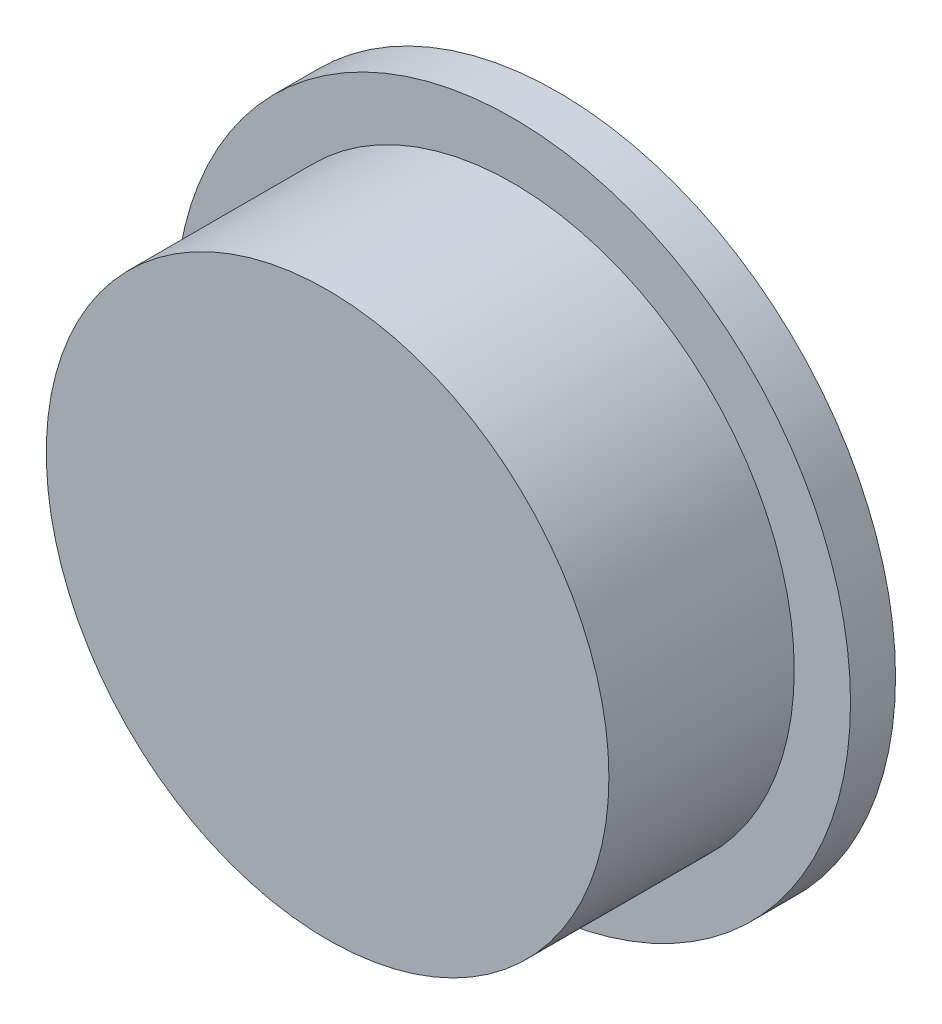
ISO-10303-21;
HEADER;
FILE_DESCRIPTION(('STEP AP214'),'2;1');
FILE_NAME('part.step','',(''),(''),'','','');
FILE_SCHEMA(('AUTOMOTIVE_DESIGN { 1 0 10303 214 1 1 1 1 }'));
ENDSEC;
DATA;
#1=APPLICATION_CONTEXT('core data for automotive mechanical design processes');
#2=APPLICATION_PROTOCOL_DEFINITION('international standard','automotive_design',2000,#1);
#3=PRODUCT_CONTEXT('',#1,'mechanical');
#4=PRODUCT('Part','Part','',(#3));
#5=PRODUCT_RELATED_PRODUCT_CATEGORY('part','',(#4));
#6=PRODUCT_DEFINITION_FORMATION('','',#4);
#7=PRODUCT_DEFINITION_CONTEXT('part definition',#1,'design');
#8=PRODUCT_DEFINITION('design','',#6,#7);
#9=PRODUCT_DEFINITION_SHAPE('','',#8);
#10=(LENGTH_UNIT() NAMED_UNIT(*) SI_UNIT(.MILLI.,.METRE.));
#11=(NAMED_UNIT(*) PLANE_ANGLE_UNIT() SI_UNIT($,.RADIAN.));
#12=(NAMED_UNIT(*) SI_UNIT($,.STERADIAN.) SOLID_ANGLE_UNIT());
#13=UNCERTAINTY_MEASURE_WITH_UNIT(LENGTH_MEASURE(1.E-05),#10,'distance_accuracy_value','');
#14=(GEOMETRIC_REPRESENTATION_CONTEXT(3) GLOBAL_UNCERTAINTY_ASSIGNED_CONTEXT((#13)) GLOBAL_UNIT_ASSIGNED_CONTEXT((#10,
#11,#12)) REPRESENTATION_CONTEXT('',''));
#15=CARTESIAN_POINT('',(0.,0.,0.));
#16=DIRECTION('',(0.,0.,1.));
#17=DIRECTION('',(1.,0.,0.));
#18=AXIS2_PLACEMENT_3D('',#15,#16,#17);
#19=CARTESIAN_POINT('',(0.,0.,1.016));
#20=DIRECTION('',(0.,0.,-1.));
#21=DIRECTION('',(-1.,0.,0.));
#22=AXIS2_PLACEMENT_3D('',#19,#20,#21);
#23=CYLINDRICAL_SURFACE('',#22,7.62);
#24=CARTESIAN_POINT('',(0.,0.,1.016));
#25=DIRECTION('',(0.,0.,1.));
#26=DIRECTION('',(1.,0.,0.));
#27=AXIS2_PLACEMENT_3D('',#24,#25,#26);
#28=CIRCLE('',#27,7.62);
#29=CARTESIAN_POINT('',(7.62,0.,1.016));
#30=VERTEX_POINT('',#29);
#31=EDGE_CURVE('E38',#30,#30,#28,.T.);
#32=ORIENTED_EDGE('',*,*,#31,.F.);
#33=EDGE_LOOP('',(#32));
#34=FACE_BOUND('',#33,.T.);
#35=CARTESIAN_POINT('',(0.,0.,0.));
#36=DIRECTION('',(0.,0.,1.));
#37=DIRECTION('',(1.,0.,0.));
#38=AXIS2_PLACEMENT_3D('',#35,#36,#37);
#39=CIRCLE('',#38,7.62);
#40=CARTESIAN_POINT('',(7.62,0.,0.));
#41=VERTEX_POINT('',#40);
#42=EDGE_CURVE('E34',#41,#41,#39,.T.);
#43=ORIENTED_EDGE('',*,*,#42,.T.);
#44=EDGE_LOOP('',(#43));
#45=FACE_BOUND('',#44,.T.);
#46=ADVANCED_FACE('F31',(#34,#45),#23,.T.);
#47=CARTESIAN_POINT('',(0.,0.,1.016));
#48=DIRECTION('',(0.,0.,1.));
#49=DIRECTION('',(1.,0.,0.));
#50=AXIS2_PLACEMENT_3D('',#47,#48,#49);
#51=PLANE('',#50);
#52=CARTESIAN_POINT('',(0.,0.,1.016));
#53=DIRECTION('',(0.,0.,1.));
#54=DIRECTION('',(1.,0.,0.));
#55=AXIS2_PLACEMENT_3D('',#52,#53,#54);
#56=CIRCLE('',#55,6.35);
#57=CARTESIAN_POINT('',(6.35,0.,1.016));
#58=VERTEX_POINT('',#57);
#59=EDGE_CURVE('E10',#58,#58,#56,.T.);
#60=ORIENTED_EDGE('',*,*,#59,.F.);
#61=EDGE_LOOP('',(#60));
#62=FACE_BOUND('',#61,.T.);
#63=ORIENTED_EDGE('',*,*,#31,.T.);
#64=EDGE_LOOP('',(#63));
#65=FACE_BOUND('',#64,.T.);
#66=ADVANCED_FACE('F55',(#62,#65),#51,.T.);
#67=CARTESIAN_POINT('',(0.,0.,0.));
#68=DIRECTION('',(0.,0.,1.));
#69=DIRECTION('',(1.,0.,0.));
#70=AXIS2_PLACEMENT_3D('',#67,#68,#69);
#71=PLANE('',#70);
#72=ORIENTED_EDGE('',*,*,#42,.F.);
#73=EDGE_LOOP('',(#72));
#74=FACE_BOUND('',#73,.T.);
#75=ADVANCED_FACE('F52',(#74),#71,.F.);
#76=CARTESIAN_POINT('',(0.,0.,5.19938));
#77=DIRECTION('',(0.,0.,-1.));
#78=DIRECTION('',(-1.,0.,0.));
#79=AXIS2_PLACEMENT_3D('',#76,#77,#78);
#80=CYLINDRICAL_SURFACE('',#79,6.35);
#81=CARTESIAN_POINT('',(0.,0.,5.19938));
#82=DIRECTION('',(0.,0.,1.));
#83=DIRECTION('',(1.,0.,0.));
#84=AXIS2_PLACEMENT_3D('',#81,#82,#83);
#85=CIRCLE('',#84,6.35);
#86=CARTESIAN_POINT('',(6.35,0.,5.19938));
#87=VERTEX_POINT('',#86);
#88=EDGE_CURVE('E44',#87,#87,#85,.T.);
#89=ORIENTED_EDGE('',*,*,#88,.F.);
#90=EDGE_LOOP('',(#89));
#91=FACE_BOUND('',#90,.T.);
#92=ORIENTED_EDGE('',*,*,#59,.T.);
#93=EDGE_LOOP('',(#92));
#94=FACE_BOUND('',#93,.T.);
#95=ADVANCED_FACE('F54',(#91,#94),#80,.T.);
#96=CARTESIAN_POINT('',(0.,0.,5.19938));
#97=DIRECTION('',(0.,0.,1.));
#98=DIRECTION('',(1.,0.,0.));
#99=AXIS2_PLACEMENT_3D('',#96,#97,#98);
#100=PLANE('',#99);
#101=ORIENTED_EDGE('',*,*,#88,.T.);
#102=EDGE_LOOP('',(#101));
#103=FACE_BOUND('',#102,.T.);
#104=ADVANCED_FACE('F60',(#103),#100,.T.);
#105=CLOSED_SHELL('',(#46,#66,#75,#95,#104));
#106=MANIFOLD_SOLID_BREP('B2',#105);
#107=ADVANCED_BREP_SHAPE_REPRESENTATION('',(#18,#106),#14);
#108=SHAPE_DEFINITION_REPRESENTATION(#9,#107);
ENDSEC;
END-ISO-10303-21;
